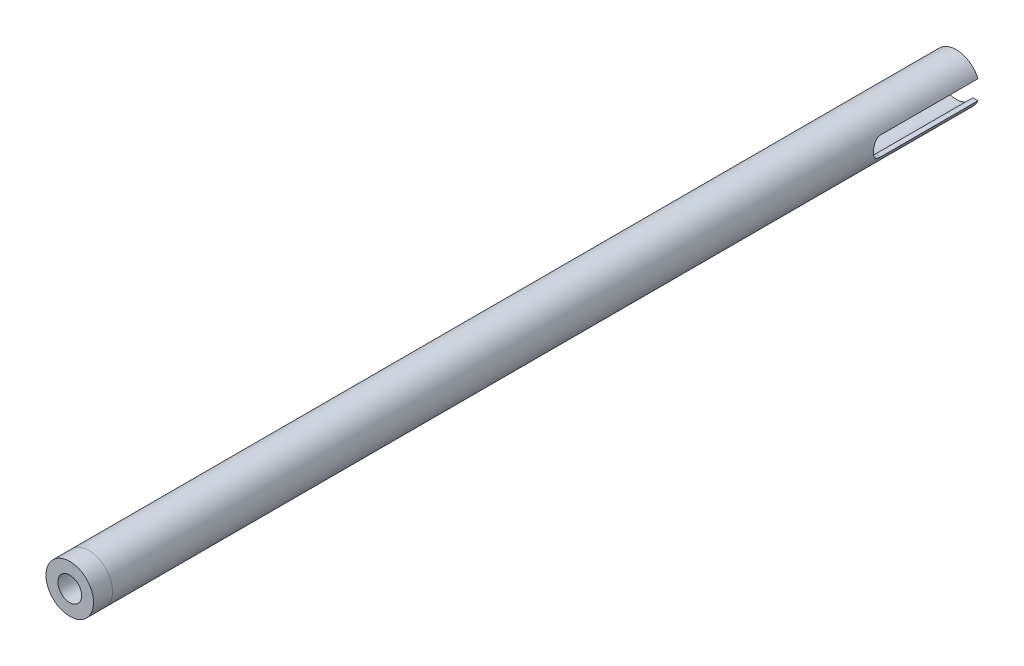
ISO-10303-21;
HEADER;
FILE_DESCRIPTION(('STEP AP214'),'2;1');
FILE_NAME('part.step','',(''),(''),'','','');
FILE_SCHEMA(('AUTOMOTIVE_DESIGN { 1 0 10303 214 1 1 1 1 }'));
ENDSEC;
DATA;
#1=APPLICATION_CONTEXT('core data for automotive mechanical design processes');
#2=APPLICATION_PROTOCOL_DEFINITION('international standard','automotive_design',2000,#1);
#3=PRODUCT_CONTEXT('',#1,'mechanical');
#4=PRODUCT('Part','Part','',(#3));
#5=PRODUCT_RELATED_PRODUCT_CATEGORY('part','',(#4));
#6=PRODUCT_DEFINITION_FORMATION('','',#4);
#7=PRODUCT_DEFINITION_CONTEXT('part definition',#1,'design');
#8=PRODUCT_DEFINITION('design','',#6,#7);
#9=PRODUCT_DEFINITION_SHAPE('','',#8);
#10=(LENGTH_UNIT() NAMED_UNIT(*) SI_UNIT(.MILLI.,.METRE.));
#11=(NAMED_UNIT(*) PLANE_ANGLE_UNIT() SI_UNIT($,.RADIAN.));
#12=(NAMED_UNIT(*) SI_UNIT($,.STERADIAN.) SOLID_ANGLE_UNIT());
#13=UNCERTAINTY_MEASURE_WITH_UNIT(LENGTH_MEASURE(1.E-05),#10,'distance_accuracy_value','');
#14=(GEOMETRIC_REPRESENTATION_CONTEXT(3) GLOBAL_UNCERTAINTY_ASSIGNED_CONTEXT((#13)) GLOBAL_UNIT_ASSIGNED_CONTEXT((#10,
#11,#12)) REPRESENTATION_CONTEXT('',''));
#15=CARTESIAN_POINT('',(0.,0.,0.));
#16=DIRECTION('',(0.,0.,1.));
#17=DIRECTION('',(1.,0.,0.));
#18=AXIS2_PLACEMENT_3D('',#15,#16,#17);
#19=CARTESIAN_POINT('',(0.,0.,-295.567143679194));
#20=DIRECTION('',(0.,0.,1.));
#21=DIRECTION('',(1.,0.,0.));
#22=AXIS2_PLACEMENT_3D('',#19,#20,#21);
#23=CYLINDRICAL_SURFACE('',#22,7.9375);
#24=CARTESIAN_POINT('',(0.,0.,-6.35));
#25=DIRECTION('',(0.,0.,1.));
#26=DIRECTION('',(1.,0.,0.));
#27=AXIS2_PLACEMENT_3D('',#24,#25,#26);
#28=CIRCLE('',#27,7.9375);
#29=CARTESIAN_POINT('',(7.9375,0.,-6.35));
#30=VERTEX_POINT('',#29);
#31=EDGE_CURVE('E165',#30,#30,#28,.T.);
#32=ORIENTED_EDGE('',*,*,#31,.F.);
#33=EDGE_LOOP('',(#32));
#34=FACE_BOUND('',#33,.T.);
#35=CARTESIAN_POINT('',(-7.2748389157424,3.175,-263.182143679194));
#36=CARTESIAN_POINT('',(-7.27482137043434,3.17501267173453,-263.096723563711));
#37=CARTESIAN_POINT('',(-7.27634297592672,3.17155313247793,-263.011313034149));
#38=CARTESIAN_POINT('',(-7.28233338484875,3.15778866907725,-262.841181029821));
#39=CARTESIAN_POINT('',(-7.28680106535325,3.14748635311323,-262.756459304962));
#40=CARTESIAN_POINT('',(-7.2985291631267,3.12019002880163,-262.588645605153));
#41=CARTESIAN_POINT('',(-7.30577831906487,3.10322299732752,-262.505548460394));
#42=CARTESIAN_POINT('',(-7.32282161153744,3.06278779397035,-262.341237358368));
#43=CARTESIAN_POINT('',(-7.33261590324725,3.03931922568674,-262.260023516255));
#44=CARTESIAN_POINT('',(-7.36535331460444,2.95952924342962,-262.020198693672));
#45=CARTESIAN_POINT('',(-7.39167595677839,2.89376893609239,-261.865073764868));
#46=CARTESIAN_POINT('',(-7.45033259991547,2.73920602658923,-261.567986338157));
#47=CARTESIAN_POINT('',(-7.48267254395243,2.65038060922872,-261.426037062939));
#48=CARTESIAN_POINT('',(-7.55175295441386,2.44684429809695,-261.15131629342));
#49=CARTESIAN_POINT('',(-7.58863404630154,2.33103943595689,-261.019388908908));
#50=CARTESIAN_POINT('',(-7.66147718953598,2.07914562663536,-260.776226025276));
#51=CARTESIAN_POINT('',(-7.69743902899202,1.94305205135848,-260.664995260348));
#52=CARTESIAN_POINT('',(-7.76611692840651,1.64778282664419,-260.462074060853));
#53=CARTESIAN_POINT('',(-7.79864638434712,1.48790317306356,-260.371339649449));
#54=CARTESIAN_POINT('',(-7.85502980346525,1.15369615984563,-260.218482096032));
#55=CARTESIAN_POINT('',(-7.87889360585224,0.979385463602722,-260.156326483414));
#56=CARTESIAN_POINT('',(-7.91022225039827,0.670405323433354,-260.075814839758));
#57=CARTESIAN_POINT('',(-7.92038443902171,0.537888188660439,-260.050136916349));
#58=CARTESIAN_POINT('',(-7.93061686811603,0.337231082382107,-260.024381833267));
#59=CARTESIAN_POINT('',(-7.93319257341971,0.269991647180298,-260.017923735987));
#60=CARTESIAN_POINT('',(-7.93663621925193,0.135173873369596,-260.009302718235));
#61=CARTESIAN_POINT('',(-7.93750363389236,0.0675954368175869,-260.007141120416));
#62=CARTESIAN_POINT('',(-7.9375,0.,-260.007143679194));
#63=B_SPLINE_CURVE_WITH_KNOTS('',3,(#35,#36,#37,#38,#39,#40,#41,#42,#43,#44,#45,#46,#47,#48,#49,
#50,#51,#52,#53,#54,#55,#56,#57,#58,#59,#60,#61,#62),.UNSPECIFIED.,.F.,.F.,(4,2,2,2,2,2,2,2,2,2,
2,2,2,4),(0.,0.256160797396612,0.512224013007058,0.767261264672238,1.02231406945471,
1.53142416248594,2.04103978047897,2.57679273649398,3.11266809162683,3.66991136029742,
4.22651992730645,4.63134321412666,4.8339937586662,5.03670667834028),.UNSPECIFIED.);
#64=CARTESIAN_POINT('',(-7.2748389157424,3.175,-263.182143679194));
#65=VERTEX_POINT('',#64);
#66=CARTESIAN_POINT('',(-7.9375,0.,-260.007143679194));
#67=VERTEX_POINT('',#66);
#68=EDGE_CURVE('E192',#65,#67,#63,.T.);
#69=ORIENTED_EDGE('',*,*,#68,.T.);
#70=CARTESIAN_POINT('',(-7.9375,0.,-260.007143679194));
#71=CARTESIAN_POINT('',(-7.93751279435796,-0.0856973243893185,-260.007131649025));
#72=CARTESIAN_POINT('',(-7.93611246860092,-0.171386675169291,-260.010613016497));
#73=CARTESIAN_POINT('',(-7.93058107051394,-0.342092796869088,-260.024469111831));
#74=CARTESIAN_POINT('',(-7.92645080745519,-0.427109759557717,-260.034841796815));
#75=CARTESIAN_POINT('',(-7.91557399086504,-0.595570690948319,-260.062338990882));
#76=CARTESIAN_POINT('',(-7.90883664469869,-0.67901912358001,-260.079439742155));
#77=CARTESIAN_POINT('',(-7.89293284658536,-0.844038966454646,-260.120206989628));
#78=CARTESIAN_POINT('',(-7.88376629739099,-0.925610301410303,-260.143873748685));
#79=CARTESIAN_POINT('',(-7.85297007832481,-1.16656173687588,-260.224381404384));
#80=CARTESIAN_POINT('',(-7.82802544143958,-1.32244720282989,-260.290774037261));
#81=CARTESIAN_POINT('',(-7.77174407779742,-1.62081902572888,-260.446819441254));
#82=CARTESIAN_POINT('',(-7.74040257287306,-1.7632952496653,-260.536489613317));
#83=CARTESIAN_POINT('',(-7.67287736621953,-2.03755465224644,-260.740943220832));
#84=CARTESIAN_POINT('',(-7.63654472176442,-2.16862853615059,-260.856630077564));
#85=CARTESIAN_POINT('',(-7.56380976030912,-2.41011022612819,-261.107924179273));
#86=CARTESIAN_POINT('',(-7.52740741976911,-2.52050895891189,-261.243540123755));
#87=CARTESIAN_POINT('',(-7.45683282624284,-2.72240939900242,-261.538238618621));
#88=CARTESIAN_POINT('',(-7.4228346735038,-2.81283701743189,-261.698102608537));
#89=CARTESIAN_POINT('',(-7.3633362219632,-2.96511894168388,-262.032228573333));
#90=CARTESIAN_POINT('',(-7.33782422493328,-3.02701262758154,-262.206470311092));
#91=CARTESIAN_POINT('',(-7.30424985403508,-3.10695047193342,-262.514774035744));
#92=CARTESIAN_POINT('',(-7.29331360019113,-3.13238569878909,-262.64663279663));
#93=CARTESIAN_POINT('',(-7.28227977674291,-3.15790858319001,-262.846349678324));
#94=CARTESIAN_POINT('',(-7.27949685702346,-3.16431127275807,-262.913297969083));
#95=CARTESIAN_POINT('',(-7.27577355567174,-3.17285909036155,-263.04753952695));
#96=CARTESIAN_POINT('',(-7.27483380475762,-3.1750027609968,-263.114832904247));
#97=CARTESIAN_POINT('',(-7.2748389157424,-3.175,-263.182143679194));
#98=B_SPLINE_CURVE_WITH_KNOTS('',3,(#70,#71,#72,#73,#74,#75,#76,#77,#78,#79,#80,#81,#82,#83,#84,
#85,#86,#87,#88,#89,#90,#91,#92,#93,#94,#95,#96,#97),.UNSPECIFIED.,.F.,.F.,(4,2,2,2,2,2,2,2,2,2,
2,2,2,4),(0.,0.256996432008007,0.513916713336978,0.769937797705386,1.02596913282157,
1.53722547809954,2.04886511530059,2.58219314099272,3.11575467201799,3.67332953074261,
4.2301325519037,4.63306130520181,4.83485003827446,5.03670780985612),.UNSPECIFIED.);
#99=CARTESIAN_POINT('',(-7.2748389157424,-3.175,-263.182143679194));
#100=VERTEX_POINT('',#99);
#101=EDGE_CURVE('E144',#67,#100,#98,.T.);
#102=ORIENTED_EDGE('',*,*,#101,.T.);
#103=DIRECTION('',(0.,0.,-1.));
#104=VECTOR('',#103,1.);
#105=CARTESIAN_POINT('',(-7.2748389157424,-3.175,-260.007143679194));
#106=LINE('',#105,#104);
#107=CARTESIAN_POINT('',(-7.2748389157424,-3.175,-295.567143679194));
#108=VERTEX_POINT('',#107);
#109=EDGE_CURVE('E139',#100,#108,#106,.T.);
#110=ORIENTED_EDGE('',*,*,#109,.T.);
#111=CARTESIAN_POINT('',(0.,0.,-295.567143679194));
#112=DIRECTION('',(0.,0.,1.));
#113=DIRECTION('',(1.,0.,0.));
#114=AXIS2_PLACEMENT_3D('',#111,#112,#113);
#115=CIRCLE('',#114,7.9375);
#116=CARTESIAN_POINT('',(7.2748389157424,-3.175,-295.567143679194));
#117=VERTEX_POINT('',#116);
#118=EDGE_CURVE('E142',#108,#117,#115,.T.);
#119=ORIENTED_EDGE('',*,*,#118,.T.);
#120=DIRECTION('',(0.,0.,-1.));
#121=VECTOR('',#120,1.);
#122=CARTESIAN_POINT('',(7.2748389157424,-3.175,-260.007143679194));
#123=LINE('',#122,#121);
#124=CARTESIAN_POINT('',(7.2748389157424,-3.175,-263.182143679194));
#125=VERTEX_POINT('',#124);
#126=EDGE_CURVE('E425',#125,#117,#123,.T.);
#127=ORIENTED_EDGE('',*,*,#126,.F.);
#128=CARTESIAN_POINT('',(7.2748389157424,-3.175,-263.182143679194));
#129=CARTESIAN_POINT('',(7.27482137043434,-3.17501267173453,-263.096723563711));
#130=CARTESIAN_POINT('',(7.27634297592672,-3.17155313247793,-263.011313034149));
#131=CARTESIAN_POINT('',(7.28233338484875,-3.15778866907725,-262.841181029821));
#132=CARTESIAN_POINT('',(7.28680106535325,-3.14748635311323,-262.756459304962));
#133=CARTESIAN_POINT('',(7.2985291631267,-3.12019002880163,-262.588645605153));
#134=CARTESIAN_POINT('',(7.30577831906487,-3.10322299732752,-262.505548460394));
#135=CARTESIAN_POINT('',(7.32282161153744,-3.06278779397035,-262.341237358368));
#136=CARTESIAN_POINT('',(7.33261590324725,-3.03931922568674,-262.260023516255));
#137=CARTESIAN_POINT('',(7.36535331460444,-2.95952924342962,-262.020198693672));
#138=CARTESIAN_POINT('',(7.39167595677839,-2.89376893609239,-261.865073764868));
#139=CARTESIAN_POINT('',(7.45033259991547,-2.73920602658923,-261.567986338157));
#140=CARTESIAN_POINT('',(7.48267254395243,-2.65038060922872,-261.426037062939));
#141=CARTESIAN_POINT('',(7.55175295441386,-2.44684429809695,-261.15131629342));
#142=CARTESIAN_POINT('',(7.58863404630154,-2.33103943595689,-261.019388908908));
#143=CARTESIAN_POINT('',(7.66147718953598,-2.07914562663536,-260.776226025276));
#144=CARTESIAN_POINT('',(7.69743902899202,-1.94305205135848,-260.664995260348));
#145=CARTESIAN_POINT('',(7.76611692840651,-1.64778282664419,-260.462074060853));
#146=CARTESIAN_POINT('',(7.79864638434712,-1.48790317306356,-260.371339649449));
#147=CARTESIAN_POINT('',(7.85502980346525,-1.15369615984563,-260.218482096032));
#148=CARTESIAN_POINT('',(7.87889360585224,-0.979385463602722,-260.156326483414));
#149=CARTESIAN_POINT('',(7.91022225039827,-0.670405323433354,-260.075814839758));
#150=CARTESIAN_POINT('',(7.92038443902171,-0.537888188660439,-260.050136916349));
#151=CARTESIAN_POINT('',(7.93061686811603,-0.337231082382107,-260.024381833267));
#152=CARTESIAN_POINT('',(7.93319257341971,-0.269991647180298,-260.017923735987));
#153=CARTESIAN_POINT('',(7.93663621925193,-0.135173873369596,-260.009302718235));
#154=CARTESIAN_POINT('',(7.93750363389236,-0.0675954368175869,-260.007141120416));
#155=CARTESIAN_POINT('',(7.9375,0.,-260.007143679194));
#156=B_SPLINE_CURVE_WITH_KNOTS('',3,(#128,#129,#130,#131,#132,#133,#134,#135,#136,#137,#138,
#139,#140,#141,#142,#143,#144,#145,#146,#147,#148,#149,#150,#151,#152,#153,#154,#155),
.UNSPECIFIED.,.F.,.F.,(4,2,2,2,2,2,2,2,2,2,2,2,2,4),(0.,0.256160797396612,0.512224013007058,
0.767261264672238,1.02231406945471,1.53142416248594,2.04103978047897,2.57679273649398,
3.11266809162683,3.66991136029742,4.22651992730645,4.63134321412666,4.8339937586662,
5.03670667834028),.UNSPECIFIED.);
#157=CARTESIAN_POINT('',(7.9375,0.,-260.007143679194));
#158=VERTEX_POINT('',#157);
#159=EDGE_CURVE('E85',#125,#158,#156,.T.);
#160=ORIENTED_EDGE('',*,*,#159,.T.);
#161=CARTESIAN_POINT('',(7.9375,0.,-260.007143679194));
#162=CARTESIAN_POINT('',(7.93751279435796,0.0856973243893185,-260.007131649025));
#163=CARTESIAN_POINT('',(7.93611246860092,0.171386675169291,-260.010613016497));
#164=CARTESIAN_POINT('',(7.93058107051394,0.342092796869088,-260.024469111831));
#165=CARTESIAN_POINT('',(7.92645080745519,0.427109759557717,-260.034841796815));
#166=CARTESIAN_POINT('',(7.91557399086504,0.595570690948319,-260.062338990882));
#167=CARTESIAN_POINT('',(7.90883664469869,0.67901912358001,-260.079439742155));
#168=CARTESIAN_POINT('',(7.89293284658536,0.844038966454646,-260.120206989628));
#169=CARTESIAN_POINT('',(7.88376629739099,0.925610301410303,-260.143873748685));
#170=CARTESIAN_POINT('',(7.85297007832481,1.16656173687588,-260.224381404384));
#171=CARTESIAN_POINT('',(7.82802544143958,1.32244720282989,-260.290774037261));
#172=CARTESIAN_POINT('',(7.77174407779742,1.62081902572888,-260.446819441254));
#173=CARTESIAN_POINT('',(7.74040257287306,1.7632952496653,-260.536489613317));
#174=CARTESIAN_POINT('',(7.67287736621953,2.03755465224644,-260.740943220832));
#175=CARTESIAN_POINT('',(7.63654472176442,2.16862853615059,-260.856630077564));
#176=CARTESIAN_POINT('',(7.56380976030912,2.41011022612819,-261.107924179273));
#177=CARTESIAN_POINT('',(7.52740741976911,2.52050895891189,-261.243540123755));
#178=CARTESIAN_POINT('',(7.45683282624284,2.72240939900242,-261.538238618621));
#179=CARTESIAN_POINT('',(7.4228346735038,2.81283701743189,-261.698102608537));
#180=CARTESIAN_POINT('',(7.3633362219632,2.96511894168388,-262.032228573333));
#181=CARTESIAN_POINT('',(7.33782422493328,3.02701262758154,-262.206470311092));
#182=CARTESIAN_POINT('',(7.30424985403508,3.10695047193342,-262.514774035744));
#183=CARTESIAN_POINT('',(7.29331360019113,3.13238569878909,-262.64663279663));
#184=CARTESIAN_POINT('',(7.28227977674291,3.15790858319001,-262.846349678324));
#185=CARTESIAN_POINT('',(7.27949685702346,3.16431127275807,-262.913297969083));
#186=CARTESIAN_POINT('',(7.27577355567174,3.17285909036155,-263.04753952695));
#187=CARTESIAN_POINT('',(7.27483380475762,3.1750027609968,-263.114832904247));
#188=CARTESIAN_POINT('',(7.2748389157424,3.175,-263.182143679194));
#189=B_SPLINE_CURVE_WITH_KNOTS('',3,(#161,#162,#163,#164,#165,#166,#167,#168,#169,#170,#171,
#172,#173,#174,#175,#176,#177,#178,#179,#180,#181,#182,#183,#184,#185,#186,#187,#188),
.UNSPECIFIED.,.F.,.F.,(4,2,2,2,2,2,2,2,2,2,2,2,2,4),(0.,0.256996432008007,0.513916713336978,
0.769937797705386,1.02596913282157,1.53722547809954,2.04886511530059,2.58219314099272,
3.11575467201799,3.67332953074261,4.2301325519037,4.63306130520181,4.83485003827446,
5.03670780985612),.UNSPECIFIED.);
#190=CARTESIAN_POINT('',(7.2748389157424,3.175,-263.182143679194));
#191=VERTEX_POINT('',#190);
#192=EDGE_CURVE('E71',#158,#191,#189,.T.);
#193=ORIENTED_EDGE('',*,*,#192,.T.);
#194=DIRECTION('',(0.,0.,-1.));
#195=VECTOR('',#194,1.);
#196=CARTESIAN_POINT('',(7.2748389157424,3.175,-260.007143679194));
#197=LINE('',#196,#195);
#198=CARTESIAN_POINT('',(7.2748389157424,3.175,-295.567143679194));
#199=VERTEX_POINT('',#198);
#200=EDGE_CURVE('E158',#191,#199,#197,.T.);
#201=ORIENTED_EDGE('',*,*,#200,.T.);
#202=CARTESIAN_POINT('',(-7.2748389157424,3.175,-295.567143679194));
#203=VERTEX_POINT('',#202);
#204=EDGE_CURVE('E164',#199,#203,#115,.T.);
#205=ORIENTED_EDGE('',*,*,#204,.T.);
#206=DIRECTION('',(0.,0.,-1.));
#207=VECTOR('',#206,1.);
#208=CARTESIAN_POINT('',(-7.2748389157424,3.175,-260.007143679194));
#209=LINE('',#208,#207);
#210=EDGE_CURVE('E418',#65,#203,#209,.T.);
#211=ORIENTED_EDGE('',*,*,#210,.F.);
#212=EDGE_LOOP('',(#69,#102,#110,#119,#127,#160,#193,#201,#205,#211));
#213=FACE_BOUND('',#212,.T.);
#214=ADVANCED_FACE('F61',(#34,#213),#23,.T.);
#215=CARTESIAN_POINT('',(0.,0.,-295.567143679194));
#216=DIRECTION('',(0.,0.,1.));
#217=DIRECTION('',(1.,0.,0.));
#218=AXIS2_PLACEMENT_3D('',#215,#216,#217);
#219=PLANE('',#218);
#220=DIRECTION('',(1.,0.,0.));
#221=VECTOR('',#220,1.);
#222=CARTESIAN_POINT('',(0.,-3.175,-295.567143679194));
#223=LINE('',#222,#221);
#224=CARTESIAN_POINT('',(-5.57246419907746,-3.175,-295.567143679194));
#225=VERTEX_POINT('',#224);
#226=EDGE_CURVE('E151',#108,#225,#223,.T.);
#227=ORIENTED_EDGE('',*,*,#226,.T.);
#228=CARTESIAN_POINT('',(0.,0.,-295.567143679194));
#229=DIRECTION('',(0.,0.,1.));
#230=DIRECTION('',(1.,0.,0.));
#231=AXIS2_PLACEMENT_3D('',#228,#229,#230);
#232=CIRCLE('',#231,6.4135);
#233=CARTESIAN_POINT('',(5.57246419907746,-3.175,-295.567143679194));
#234=VERTEX_POINT('',#233);
#235=EDGE_CURVE('E273',#225,#234,#232,.T.);
#236=ORIENTED_EDGE('',*,*,#235,.T.);
#237=DIRECTION('',(1.,0.,0.));
#238=VECTOR('',#237,1.);
#239=CARTESIAN_POINT('',(0.,-3.175,-295.567143679194));
#240=LINE('',#239,#238);
#241=EDGE_CURVE('E163',#234,#117,#240,.T.);
#242=ORIENTED_EDGE('',*,*,#241,.T.);
#243=ORIENTED_EDGE('',*,*,#118,.F.);
#244=EDGE_LOOP('',(#227,#236,#242,#243));
#245=FACE_BOUND('',#244,.T.);
#246=ADVANCED_FACE('F161',(#245),#219,.F.);
#247=CARTESIAN_POINT('',(0.,0.,-295.567143679194));
#248=DIRECTION('',(0.,0.,1.));
#249=DIRECTION('',(1.,0.,0.));
#250=AXIS2_PLACEMENT_3D('',#247,#248,#249);
#251=CYLINDRICAL_SURFACE('',#250,6.4135);
#252=CARTESIAN_POINT('',(0.,0.,-6.35));
#253=DIRECTION('',(0.,0.,1.));
#254=DIRECTION('',(1.,0.,0.));
#255=AXIS2_PLACEMENT_3D('',#252,#253,#254);
#256=CIRCLE('',#255,6.4135);
#257=CARTESIAN_POINT('',(6.4135,0.,-6.35));
#258=VERTEX_POINT('',#257);
#259=EDGE_CURVE('E147',#258,#258,#256,.T.);
#260=ORIENTED_EDGE('',*,*,#259,.T.);
#261=EDGE_LOOP('',(#260));
#262=FACE_BOUND('',#261,.T.);
#263=DIRECTION('',(0.,0.,-1.));
#264=VECTOR('',#263,1.);
#265=CARTESIAN_POINT('',(-5.57246419907746,-3.175,-260.007143679194));
#266=LINE('',#265,#264);
#267=CARTESIAN_POINT('',(-5.57246419907746,-3.175,-263.182143679194));
#268=VERTEX_POINT('',#267);
#269=EDGE_CURVE('E148',#268,#225,#266,.T.);
#270=ORIENTED_EDGE('',*,*,#269,.F.);
#271=CARTESIAN_POINT('',(-5.57246419907746,-3.175,-263.182143679194));
#272=CARTESIAN_POINT('',(-5.57244013006406,-3.17501485930532,-263.098864566155));
#273=CARTESIAN_POINT('',(-5.57433046393327,-3.17172393593588,-263.015598799285));
#274=CARTESIAN_POINT('',(-5.58175879139227,-3.15864741746939,-262.849791214473));
#275=CARTESIAN_POINT('',(-5.58729459414879,-3.14886572313217,-262.767248991872));
#276=CARTESIAN_POINT('',(-5.60179156831922,-3.12299843383605,-262.603952185143));
#277=CARTESIAN_POINT('',(-5.61073298145,-3.10694918790095,-262.523190080229));
#278=CARTESIAN_POINT('',(-5.63171276239417,-3.06875665913499,-262.363546164728));
#279=CARTESIAN_POINT('',(-5.64375147558632,-3.04661269666535,-262.284664564908));
#280=CARTESIAN_POINT('',(-5.6838799338154,-2.97148657354666,-262.05193138991));
#281=CARTESIAN_POINT('',(-5.71602843451584,-2.90973243042152,-261.901510892671));
#282=CARTESIAN_POINT('',(-5.78746445334561,-2.76491119647661,-261.613053675843));
#283=CARTESIAN_POINT('',(-5.8267630725243,-2.68181088046089,-261.475036718477));
#284=CARTESIAN_POINT('',(-5.91189137020974,-2.48887418737119,-261.203239634448));
#285=CARTESIAN_POINT('',(-5.95799203211627,-2.37743022169016,-261.070682831997));
#286=CARTESIAN_POINT('',(-6.04933625068999,-2.13433179626949,-260.825215162924));
#287=CARTESIAN_POINT('',(-6.09457954365871,-2.00267122837297,-260.712310255911));
#288=CARTESIAN_POINT('',(-6.18270630442022,-1.71220053093684,-260.501990963459));
#289=CARTESIAN_POINT('',(-6.22523407848511,-1.55216870534977,-260.406101213028));
#290=CARTESIAN_POINT('',(-6.29953728626817,-1.21586879246633,-260.243252316711));
#291=CARTESIAN_POINT('',(-6.33132906884324,-1.03962591706377,-260.176249138668));
#292=CARTESIAN_POINT('',(-6.37455801221378,-0.719418942476251,-260.086377306337));
#293=CARTESIAN_POINT('',(-6.38903678436651,-0.577736145507957,-260.056804591973));
#294=CARTESIAN_POINT('',(-6.40364692368403,-0.362616983152034,-260.027083517658));
#295=CARTESIAN_POINT('',(-6.40733246196224,-0.290370591494075,-260.019616005021));
#296=CARTESIAN_POINT('',(-6.41226237468065,-0.145424356491903,-260.009643116083));
#297=CARTESIAN_POINT('',(-6.41350576158006,-0.0727243416303698,-260.007139747146));
#298=CARTESIAN_POINT('',(-6.4135,0.,-260.007143679194));
#299=B_SPLINE_CURVE_WITH_KNOTS('',3,(#271,#272,#273,#274,#275,#276,#277,#278,#279,#280,#281,
#282,#283,#284,#285,#286,#287,#288,#289,#290,#291,#292,#293,#294,#295,#296,#297,#298),
.UNSPECIFIED.,.F.,.F.,(4,2,2,2,2,2,2,2,2,2,2,2,2,4),(0.,0.249729002226608,0.499308060527582,
0.747460667546715,0.995640957972498,1.49055300136654,1.98624009021394,2.52160227908797,
3.05712653941521,3.62817923327589,4.19835836008502,4.63305000595099,4.85103401853339,
5.06910615989469),.UNSPECIFIED.);
#300=CARTESIAN_POINT('',(-6.4135,0.,-260.007143679194));
#301=VERTEX_POINT('',#300);
#302=EDGE_CURVE('E219',#268,#301,#299,.T.);
#303=ORIENTED_EDGE('',*,*,#302,.T.);
#304=CARTESIAN_POINT('',(-6.4135,0.,-260.007143679194));
#305=CARTESIAN_POINT('',(-6.41351478956105,0.0839162873638195,-260.007130279298));
#306=CARTESIAN_POINT('',(-6.41185341043851,0.167823114288182,-260.010470205345));
#307=CARTESIAN_POINT('',(-6.40528923860734,0.33495253632637,-260.02375264595));
#308=CARTESIAN_POINT('',(-6.40038773102953,0.418175389480093,-260.033692542771));
#309=CARTESIAN_POINT('',(-6.38748331817869,0.58296549878522,-260.060011347289));
#310=CARTESIAN_POINT('',(-6.37949454331383,0.664538541389253,-260.076360922777));
#311=CARTESIAN_POINT('',(-6.36062930478242,0.825821595252368,-260.11529922637));
#312=CARTESIAN_POINT('',(-6.34975266552956,0.905531492908811,-260.137888333851));
#313=CARTESIAN_POINT('',(-6.31319792977548,1.14087800407252,-260.214624896611));
#314=CARTESIAN_POINT('',(-6.28356695572383,1.29306927815055,-260.277796544799));
#315=CARTESIAN_POINT('',(-6.21648032622801,1.58455945770353,-260.425947286779));
#316=CARTESIAN_POINT('',(-6.17901685649499,1.72384528592309,-260.510948178558));
#317=CARTESIAN_POINT('',(-6.09713913910647,1.99475482128856,-260.706048316809));
#318=CARTESIAN_POINT('',(-6.05244508581476,2.12544046453043,-260.817333193548));
#319=CARTESIAN_POINT('',(-5.96206469267669,2.36716277188881,-261.059302639713));
#320=CARTESIAN_POINT('',(-5.9163776032387,2.47818397002904,-261.190002331553));
#321=CARTESIAN_POINT('',(-5.82517699615972,2.68591268931947,-261.479048160505));
#322=CARTESIAN_POINT('',(-5.77994318763785,2.78087960507694,-261.638743355085));
#323=CARTESIAN_POINT('',(-5.69959190124919,2.9420744279085,-261.974126632267));
#324=CARTESIAN_POINT('',(-5.66445328320705,3.00836254036259,-262.149780265438));
#325=CARTESIAN_POINT('',(-5.61637168534323,3.09697219420915,-262.468231639832));
#326=CARTESIAN_POINT('',(-5.60011055849822,3.1260622343607,-262.608646242492));
#327=CARTESIAN_POINT('',(-5.58363385282995,3.15533369889112,-262.822023120734));
#328=CARTESIAN_POINT('',(-5.57946041232981,3.16269716900745,-262.893754845616));
#329=CARTESIAN_POINT('',(-5.57386984218861,3.17253394278506,-263.037696785659));
#330=CARTESIAN_POINT('',(-5.57245416126573,3.17500467618403,-263.10990723233));
#331=CARTESIAN_POINT('',(-5.57246419907746,3.175,-263.182143679194));
#332=B_SPLINE_CURVE_WITH_KNOTS('',3,(#304,#305,#306,#307,#308,#309,#310,#311,#312,#313,#314,
#315,#316,#317,#318,#319,#320,#321,#322,#323,#324,#325,#326,#327,#328,#329,#330,#331),
.UNSPECIFIED.,.F.,.F.,(4,2,2,2,2,2,2,2,2,2,2,2,2,4),(0.,0.251650249697328,0.503200747298848,
0.75361328099314,1.00404104361821,1.50387930503274,2.00421864304453,2.53410176460237,
3.06439980342596,3.63519589642624,4.20478783377489,4.63602373673194,4.85251353275904,
5.06911702550462),.UNSPECIFIED.);
#333=CARTESIAN_POINT('',(-5.57246419907746,3.175,-263.182143679194));
#334=VERTEX_POINT('',#333);
#335=EDGE_CURVE('E184',#301,#334,#332,.T.);
#336=ORIENTED_EDGE('',*,*,#335,.T.);
#337=DIRECTION('',(0.,0.,-1.));
#338=VECTOR('',#337,1.);
#339=CARTESIAN_POINT('',(-5.57246419907746,3.175,-260.007143679194));
#340=LINE('',#339,#338);
#341=CARTESIAN_POINT('',(-5.57246419907746,3.175,-295.567143679194));
#342=VERTEX_POINT('',#341);
#343=EDGE_CURVE('E415',#334,#342,#340,.T.);
#344=ORIENTED_EDGE('',*,*,#343,.T.);
#345=CARTESIAN_POINT('',(5.57246419907746,3.175,-295.567143679194));
#346=VERTEX_POINT('',#345);
#347=EDGE_CURVE('E170',#346,#342,#232,.T.);
#348=ORIENTED_EDGE('',*,*,#347,.F.);
#349=DIRECTION('',(0.,0.,-1.));
#350=VECTOR('',#349,1.);
#351=CARTESIAN_POINT('',(5.57246419907746,3.175,-260.007143679194));
#352=LINE('',#351,#350);
#353=CARTESIAN_POINT('',(5.57246419907746,3.175,-263.182143679194));
#354=VERTEX_POINT('',#353);
#355=EDGE_CURVE('E267',#354,#346,#352,.T.);
#356=ORIENTED_EDGE('',*,*,#355,.F.);
#357=CARTESIAN_POINT('',(5.57246419907746,3.175,-263.182143679194));
#358=CARTESIAN_POINT('',(5.57244013006406,3.17501485930532,-263.098864566155));
#359=CARTESIAN_POINT('',(5.57433046393327,3.17172393593588,-263.015598799285));
#360=CARTESIAN_POINT('',(5.58175879139227,3.15864741746939,-262.849791214473));
#361=CARTESIAN_POINT('',(5.58729459414879,3.14886572313217,-262.767248991872));
#362=CARTESIAN_POINT('',(5.60179156831922,3.12299843383605,-262.603952185143));
#363=CARTESIAN_POINT('',(5.61073298145,3.10694918790095,-262.523190080229));
#364=CARTESIAN_POINT('',(5.63171276239417,3.06875665913499,-262.363546164728));
#365=CARTESIAN_POINT('',(5.64375147558632,3.04661269666535,-262.284664564908));
#366=CARTESIAN_POINT('',(5.6838799338154,2.97148657354666,-262.05193138991));
#367=CARTESIAN_POINT('',(5.71602843451584,2.90973243042152,-261.901510892671));
#368=CARTESIAN_POINT('',(5.78746445334561,2.76491119647661,-261.613053675843));
#369=CARTESIAN_POINT('',(5.8267630725243,2.68181088046089,-261.475036718477));
#370=CARTESIAN_POINT('',(5.91189137020974,2.48887418737119,-261.203239634448));
#371=CARTESIAN_POINT('',(5.95799203211627,2.37743022169016,-261.070682831997));
#372=CARTESIAN_POINT('',(6.04933625068999,2.13433179626949,-260.825215162924));
#373=CARTESIAN_POINT('',(6.09457954365871,2.00267122837297,-260.712310255911));
#374=CARTESIAN_POINT('',(6.18270630442022,1.71220053093684,-260.501990963459));
#375=CARTESIAN_POINT('',(6.22523407848511,1.55216870534977,-260.406101213028));
#376=CARTESIAN_POINT('',(6.29953728626817,1.21586879246633,-260.243252316711));
#377=CARTESIAN_POINT('',(6.33132906884324,1.03962591706377,-260.176249138668));
#378=CARTESIAN_POINT('',(6.37455801221378,0.719418942476251,-260.086377306337));
#379=CARTESIAN_POINT('',(6.38903678436651,0.577736145507957,-260.056804591973));
#380=CARTESIAN_POINT('',(6.40364692368403,0.362616983152034,-260.027083517658));
#381=CARTESIAN_POINT('',(6.40733246196224,0.290370591494075,-260.019616005021));
#382=CARTESIAN_POINT('',(6.41226237468065,0.145424356491903,-260.009643116083));
#383=CARTESIAN_POINT('',(6.41350576158006,0.0727243416303698,-260.007139747146));
#384=CARTESIAN_POINT('',(6.4135,0.,-260.007143679194));
#385=B_SPLINE_CURVE_WITH_KNOTS('',3,(#357,#358,#359,#360,#361,#362,#363,#364,#365,#366,#367,
#368,#369,#370,#371,#372,#373,#374,#375,#376,#377,#378,#379,#380,#381,#382,#383,#384),
.UNSPECIFIED.,.F.,.F.,(4,2,2,2,2,2,2,2,2,2,2,2,2,4),(0.,0.249729002226608,0.499308060527582,
0.747460667546715,0.995640957972498,1.49055300136654,1.98624009021394,2.52160227908797,
3.05712653941521,3.62817923327589,4.19835836008502,4.63305000595099,4.85103401853339,
5.06910615989469),.UNSPECIFIED.);
#386=CARTESIAN_POINT('',(6.4135,0.,-260.007143679194));
#387=VERTEX_POINT('',#386);
#388=EDGE_CURVE('E13',#354,#387,#385,.T.);
#389=ORIENTED_EDGE('',*,*,#388,.T.);
#390=CARTESIAN_POINT('',(6.4135,0.,-260.007143679194));
#391=CARTESIAN_POINT('',(6.41351478956105,-0.0839162873638195,-260.007130279298));
#392=CARTESIAN_POINT('',(6.41185341043851,-0.167823114288182,-260.010470205345));
#393=CARTESIAN_POINT('',(6.40528923860734,-0.33495253632637,-260.02375264595));
#394=CARTESIAN_POINT('',(6.40038773102953,-0.418175389480093,-260.033692542771));
#395=CARTESIAN_POINT('',(6.38748331817869,-0.58296549878522,-260.060011347289));
#396=CARTESIAN_POINT('',(6.37949454331383,-0.664538541389253,-260.076360922777));
#397=CARTESIAN_POINT('',(6.36062930478242,-0.825821595252368,-260.11529922637));
#398=CARTESIAN_POINT('',(6.34975266552956,-0.905531492908811,-260.137888333851));
#399=CARTESIAN_POINT('',(6.31319792977548,-1.14087800407252,-260.214624896611));
#400=CARTESIAN_POINT('',(6.28356695572383,-1.29306927815055,-260.277796544799));
#401=CARTESIAN_POINT('',(6.21648032622801,-1.58455945770353,-260.425947286779));
#402=CARTESIAN_POINT('',(6.17901685649499,-1.72384528592309,-260.510948178558));
#403=CARTESIAN_POINT('',(6.09713913910647,-1.99475482128856,-260.706048316809));
#404=CARTESIAN_POINT('',(6.05244508581476,-2.12544046453043,-260.817333193548));
#405=CARTESIAN_POINT('',(5.96206469267669,-2.36716277188881,-261.059302639713));
#406=CARTESIAN_POINT('',(5.9163776032387,-2.47818397002904,-261.190002331553));
#407=CARTESIAN_POINT('',(5.82517699615972,-2.68591268931947,-261.479048160505));
#408=CARTESIAN_POINT('',(5.77994318763785,-2.78087960507694,-261.638743355085));
#409=CARTESIAN_POINT('',(5.69959190124919,-2.9420744279085,-261.974126632267));
#410=CARTESIAN_POINT('',(5.66445328320705,-3.00836254036259,-262.149780265438));
#411=CARTESIAN_POINT('',(5.61637168534323,-3.09697219420915,-262.468231639832));
#412=CARTESIAN_POINT('',(5.60011055849822,-3.1260622343607,-262.608646242492));
#413=CARTESIAN_POINT('',(5.58363385282995,-3.15533369889112,-262.822023120734));
#414=CARTESIAN_POINT('',(5.57946041232981,-3.16269716900745,-262.893754845616));
#415=CARTESIAN_POINT('',(5.57386984218861,-3.17253394278506,-263.037696785659));
#416=CARTESIAN_POINT('',(5.57245416126573,-3.17500467618403,-263.10990723233));
#417=CARTESIAN_POINT('',(5.57246419907746,-3.175,-263.182143679194));
#418=B_SPLINE_CURVE_WITH_KNOTS('',3,(#390,#391,#392,#393,#394,#395,#396,#397,#398,#399,#400,
#401,#402,#403,#404,#405,#406,#407,#408,#409,#410,#411,#412,#413,#414,#415,#416,#417),
.UNSPECIFIED.,.F.,.F.,(4,2,2,2,2,2,2,2,2,2,2,2,2,4),(0.,0.251650249697328,0.503200747298848,
0.75361328099314,1.00404104361821,1.50387930503274,2.00421864304453,2.53410176460237,
3.06439980342596,3.63519589642624,4.20478783377489,4.63602373673194,4.85251353275904,
5.06911702550462),.UNSPECIFIED.);
#419=CARTESIAN_POINT('',(5.57246419907746,-3.175,-263.182143679194));
#420=VERTEX_POINT('',#419);
#421=EDGE_CURVE('E235',#387,#420,#418,.T.);
#422=ORIENTED_EDGE('',*,*,#421,.T.);
#423=DIRECTION('',(0.,0.,-1.));
#424=VECTOR('',#423,1.);
#425=CARTESIAN_POINT('',(5.57246419907746,-3.175,-260.007143679194));
#426=LINE('',#425,#424);
#427=EDGE_CURVE('E269',#420,#234,#426,.T.);
#428=ORIENTED_EDGE('',*,*,#427,.T.);
#429=ORIENTED_EDGE('',*,*,#235,.F.);
#430=EDGE_LOOP('',(#270,#303,#336,#344,#348,#356,#389,#422,#428,#429));
#431=FACE_BOUND('',#430,.T.);
#432=ADVANCED_FACE('F199',(#262,#431),#251,.F.);
#433=ORIENTED_EDGE('',*,*,#347,.T.);
#434=DIRECTION('',(1.,0.,0.));
#435=VECTOR('',#434,1.);
#436=CARTESIAN_POINT('',(0.,3.175,-295.567143679194));
#437=LINE('',#436,#435);
#438=EDGE_CURVE('E157',#203,#342,#437,.T.);
#439=ORIENTED_EDGE('',*,*,#438,.F.);
#440=ORIENTED_EDGE('',*,*,#204,.F.);
#441=DIRECTION('',(1.,0.,0.));
#442=VECTOR('',#441,1.);
#443=CARTESIAN_POINT('',(0.,3.175,-295.567143679194));
#444=LINE('',#443,#442);
#445=EDGE_CURVE('E251',#346,#199,#444,.T.);
#446=ORIENTED_EDGE('',*,*,#445,.F.);
#447=EDGE_LOOP('',(#433,#439,#440,#446));
#448=FACE_BOUND('',#447,.T.);
#449=ADVANCED_FACE('F284',(#448),#219,.F.);
#450=CARTESIAN_POINT('',(0.,0.,-6.35));
#451=DIRECTION('',(0.,0.,1.));
#452=DIRECTION('',(1.,0.,0.));
#453=AXIS2_PLACEMENT_3D('',#450,#451,#452);
#454=PLANE('',#453);
#455=ORIENTED_EDGE('',*,*,#259,.F.);
#456=EDGE_LOOP('',(#455));
#457=FACE_BOUND('',#456,.T.);
#458=ORIENTED_EDGE('',*,*,#31,.T.);
#459=EDGE_LOOP('',(#458));
#460=FACE_BOUND('',#459,.T.);
#461=ADVANCED_FACE('F281',(#457,#460),#454,.T.);
#462=CARTESIAN_POINT('',(0.,3.175,-260.007143679194));
#463=DIRECTION('',(0.,1.,0.));
#464=DIRECTION('',(0.,0.,1.));
#465=AXIS2_PLACEMENT_3D('',#462,#463,#464);
#466=PLANE('',#465);
#467=ORIENTED_EDGE('',*,*,#200,.F.);
#468=DIRECTION('',(1.,0.,0.));
#469=VECTOR('',#468,1.);
#470=CARTESIAN_POINT('',(5.57246419907746,3.175,-263.182143679194));
#471=LINE('',#470,#469);
#472=EDGE_CURVE('E182',#191,#354,#471,.F.);
#473=ORIENTED_EDGE('',*,*,#472,.T.);
#474=ORIENTED_EDGE('',*,*,#355,.T.);
#475=ORIENTED_EDGE('',*,*,#445,.T.);
#476=EDGE_LOOP('',(#467,#473,#474,#475));
#477=FACE_BOUND('',#476,.T.);
#478=ADVANCED_FACE('F264',(#477),#466,.F.);
#479=CARTESIAN_POINT('',(0.,-3.175,-260.007143679194));
#480=DIRECTION('',(0.,1.,0.));
#481=DIRECTION('',(0.,0.,1.));
#482=AXIS2_PLACEMENT_3D('',#479,#480,#481);
#483=PLANE('',#482);
#484=ORIENTED_EDGE('',*,*,#427,.F.);
#485=DIRECTION('',(1.,0.,0.));
#486=VECTOR('',#485,1.);
#487=CARTESIAN_POINT('',(0.,-3.175,-263.182143679194));
#488=LINE('',#487,#486);
#489=EDGE_CURVE('E179',#420,#125,#488,.T.);
#490=ORIENTED_EDGE('',*,*,#489,.T.);
#491=ORIENTED_EDGE('',*,*,#126,.T.);
#492=ORIENTED_EDGE('',*,*,#241,.F.);
#493=EDGE_LOOP('',(#484,#490,#491,#492));
#494=FACE_BOUND('',#493,.T.);
#495=ADVANCED_FACE('F359',(#494),#483,.T.);
#496=CARTESIAN_POINT('',(0.,-3.175,-260.007143679194));
#497=DIRECTION('',(0.,1.,0.));
#498=DIRECTION('',(0.,0.,1.));
#499=AXIS2_PLACEMENT_3D('',#496,#497,#498);
#500=PLANE('',#499);
#501=ORIENTED_EDGE('',*,*,#109,.F.);
#502=DIRECTION('',(1.,0.,0.));
#503=VECTOR('',#502,1.);
#504=CARTESIAN_POINT('',(0.,-3.175,-263.182143679194));
#505=LINE('',#504,#503);
#506=EDGE_CURVE('E177',#100,#268,#505,.T.);
#507=ORIENTED_EDGE('',*,*,#506,.T.);
#508=ORIENTED_EDGE('',*,*,#269,.T.);
#509=ORIENTED_EDGE('',*,*,#226,.F.);
#510=EDGE_LOOP('',(#501,#507,#508,#509));
#511=FACE_BOUND('',#510,.T.);
#512=ADVANCED_FACE('F152',(#511),#500,.T.);
#513=CARTESIAN_POINT('',(0.,3.175,-260.007143679194));
#514=DIRECTION('',(0.,1.,0.));
#515=DIRECTION('',(0.,0.,1.));
#516=AXIS2_PLACEMENT_3D('',#513,#514,#515);
#517=PLANE('',#516);
#518=ORIENTED_EDGE('',*,*,#343,.F.);
#519=DIRECTION('',(1.,0.,0.));
#520=VECTOR('',#519,1.);
#521=CARTESIAN_POINT('',(-7.2748389157424,3.175,-263.182143679194));
#522=LINE('',#521,#520);
#523=EDGE_CURVE('E168',#334,#65,#522,.F.);
#524=ORIENTED_EDGE('',*,*,#523,.T.);
#525=ORIENTED_EDGE('',*,*,#210,.T.);
#526=ORIENTED_EDGE('',*,*,#438,.T.);
#527=EDGE_LOOP('',(#518,#524,#525,#526));
#528=FACE_BOUND('',#527,.T.);
#529=ADVANCED_FACE('F214',(#528),#517,.F.);
#530=CARTESIAN_POINT('',(0.,0.,-263.182143679194));
#531=DIRECTION('',(1.,0.,0.));
#532=DIRECTION('',(0.,0.,-1.));
#533=AXIS2_PLACEMENT_3D('',#530,#531,#532);
#534=CYLINDRICAL_SURFACE('',#533,3.175);
#535=ORIENTED_EDGE('',*,*,#506,.F.);
#536=ORIENTED_EDGE('',*,*,#101,.F.);
#537=DIRECTION('',(1.,0.,0.));
#538=VECTOR('',#537,1.);
#539=CARTESIAN_POINT('',(0.,0.,-260.007143679194));
#540=LINE('',#539,#538);
#541=EDGE_CURVE('E249',#301,#67,#540,.F.);
#542=ORIENTED_EDGE('',*,*,#541,.F.);
#543=ORIENTED_EDGE('',*,*,#302,.F.);
#544=EDGE_LOOP('',(#535,#536,#542,#543));
#545=FACE_BOUND('',#544,.T.);
#546=ADVANCED_FACE('F207',(#545),#534,.F.);
#547=CARTESIAN_POINT('',(0.,0.,-263.182143679194));
#548=DIRECTION('',(-1.,0.,0.));
#549=DIRECTION('',(0.,0.,1.));
#550=AXIS2_PLACEMENT_3D('',#547,#548,#549);
#551=CYLINDRICAL_SURFACE('',#550,3.175);
#552=ORIENTED_EDGE('',*,*,#68,.F.);
#553=ORIENTED_EDGE('',*,*,#523,.F.);
#554=ORIENTED_EDGE('',*,*,#335,.F.);
#555=ORIENTED_EDGE('',*,*,#541,.T.);
#556=EDGE_LOOP('',(#552,#553,#554,#555));
#557=FACE_BOUND('',#556,.T.);
#558=ADVANCED_FACE('F203',(#557),#551,.F.);
#559=CARTESIAN_POINT('',(0.,0.,-263.182143679194));
#560=DIRECTION('',(-1.,0.,0.));
#561=DIRECTION('',(0.,0.,1.));
#562=AXIS2_PLACEMENT_3D('',#559,#560,#561);
#563=CYLINDRICAL_SURFACE('',#562,3.175);
#564=DIRECTION('',(1.,0.,0.));
#565=VECTOR('',#564,1.);
#566=CARTESIAN_POINT('',(7.2748389157424,0.,-260.007143679194));
#567=LINE('',#566,#565);
#568=EDGE_CURVE('E66',#387,#158,#567,.T.);
#569=ORIENTED_EDGE('',*,*,#568,.F.);
#570=ORIENTED_EDGE('',*,*,#388,.F.);
#571=ORIENTED_EDGE('',*,*,#472,.F.);
#572=ORIENTED_EDGE('',*,*,#192,.F.);
#573=EDGE_LOOP('',(#569,#570,#571,#572));
#574=FACE_BOUND('',#573,.T.);
#575=ADVANCED_FACE('F63',(#574),#563,.F.);
#576=CARTESIAN_POINT('',(0.,0.,-263.182143679194));
#577=DIRECTION('',(1.,0.,0.));
#578=DIRECTION('',(0.,0.,-1.));
#579=AXIS2_PLACEMENT_3D('',#576,#577,#578);
#580=CYLINDRICAL_SURFACE('',#579,3.175);
#581=ORIENTED_EDGE('',*,*,#421,.F.);
#582=ORIENTED_EDGE('',*,*,#568,.T.);
#583=ORIENTED_EDGE('',*,*,#159,.F.);
#584=ORIENTED_EDGE('',*,*,#489,.F.);
#585=EDGE_LOOP('',(#581,#582,#583,#584));
#586=FACE_BOUND('',#585,.T.);
#587=ADVANCED_FACE('F216',(#586),#580,.F.);
#588=CLOSED_SHELL('',(#214,#246,#432,#449,#461,#478,#495,#512,#529,#546,#558,#575,#587));
#589=MANIFOLD_SOLID_BREP('B2',#588);
#590=CARTESIAN_POINT('',(0.,0.,-6.35));
#591=DIRECTION('',(0.,0.,1.));
#592=DIRECTION('',(1.,0.,0.));
#593=AXIS2_PLACEMENT_3D('',#590,#591,#592);
#594=CYLINDRICAL_SURFACE('',#593,7.9375);
#595=CARTESIAN_POINT('',(0.,0.,-6.35));
#596=DIRECTION('',(0.,0.,1.));
#597=DIRECTION('',(1.,0.,0.));
#598=AXIS2_PLACEMENT_3D('',#595,#596,#597);
#599=CIRCLE('',#598,7.9375);
#600=CARTESIAN_POINT('',(7.9375,0.,-6.35));
#601=VERTEX_POINT('',#600);
#602=EDGE_CURVE('E60',#601,#601,#599,.T.);
#603=ORIENTED_EDGE('',*,*,#602,.T.);
#604=EDGE_LOOP('',(#603));
#605=FACE_BOUND('',#604,.T.);
#606=CARTESIAN_POINT('',(0.,0.,0.));
#607=DIRECTION('',(0.,0.,1.));
#608=DIRECTION('',(1.,0.,0.));
#609=AXIS2_PLACEMENT_3D('',#606,#607,#608);
#610=CIRCLE('',#609,7.9375);
#611=CARTESIAN_POINT('',(7.9375,0.,0.));
#612=VERTEX_POINT('',#611);
#613=EDGE_CURVE('E463',#612,#612,#610,.T.);
#614=ORIENTED_EDGE('',*,*,#613,.F.);
#615=EDGE_LOOP('',(#614));
#616=FACE_BOUND('',#615,.T.);
#617=ADVANCED_FACE('F452',(#605,#616),#594,.T.);
#618=CARTESIAN_POINT('',(0.,0.,-6.35));
#619=DIRECTION('',(0.,0.,1.));
#620=DIRECTION('',(1.,0.,0.));
#621=AXIS2_PLACEMENT_3D('',#618,#619,#620);
#622=CYLINDRICAL_SURFACE('',#621,3.96875);
#623=CARTESIAN_POINT('',(0.,0.,0.));
#624=DIRECTION('',(0.,0.,1.));
#625=DIRECTION('',(1.,0.,0.));
#626=AXIS2_PLACEMENT_3D('',#623,#624,#625);
#627=CIRCLE('',#626,3.96875);
#628=CARTESIAN_POINT('',(3.96875,0.,0.));
#629=VERTEX_POINT('',#628);
#630=EDGE_CURVE('E455',#629,#629,#627,.T.);
#631=ORIENTED_EDGE('',*,*,#630,.T.);
#632=EDGE_LOOP('',(#631));
#633=FACE_BOUND('',#632,.T.);
#634=CARTESIAN_POINT('',(0.,0.,-15.875));
#635=DIRECTION('',(0.,0.,1.));
#636=DIRECTION('',(1.,0.,0.));
#637=AXIS2_PLACEMENT_3D('',#634,#635,#636);
#638=CIRCLE('',#637,3.96875);
#639=CARTESIAN_POINT('',(3.96875,0.,-15.875));
#640=VERTEX_POINT('',#639);
#641=EDGE_CURVE('E475',#640,#640,#638,.T.);
#642=ORIENTED_EDGE('',*,*,#641,.F.);
#643=EDGE_LOOP('',(#642));
#644=FACE_BOUND('',#643,.T.);
#645=ADVANCED_FACE('F483',(#633,#644),#622,.F.);
#646=CARTESIAN_POINT('',(0.,0.,-6.35));
#647=DIRECTION('',(0.,0.,1.));
#648=DIRECTION('',(1.,0.,0.));
#649=AXIS2_PLACEMENT_3D('',#646,#647,#648);
#650=PLANE('',#649);
#651=CARTESIAN_POINT('',(0.,0.,-6.35));
#652=DIRECTION('',(0.,0.,1.));
#653=DIRECTION('',(1.,0.,0.));
#654=AXIS2_PLACEMENT_3D('',#651,#652,#653);
#655=CIRCLE('',#654,6.4135);
#656=CARTESIAN_POINT('',(6.4135,0.,-6.35));
#657=VERTEX_POINT('',#656);
#658=EDGE_CURVE('E465',#657,#657,#655,.T.);
#659=ORIENTED_EDGE('',*,*,#658,.T.);
#660=EDGE_LOOP('',(#659));
#661=FACE_BOUND('',#660,.T.);
#662=ORIENTED_EDGE('',*,*,#602,.F.);
#663=EDGE_LOOP('',(#662));
#664=FACE_BOUND('',#663,.T.);
#665=ADVANCED_FACE('F485',(#661,#664),#650,.F.);
#666=CARTESIAN_POINT('',(0.,0.,0.));
#667=DIRECTION('',(0.,0.,1.));
#668=DIRECTION('',(1.,0.,0.));
#669=AXIS2_PLACEMENT_3D('',#666,#667,#668);
#670=PLANE('',#669);
#671=ORIENTED_EDGE('',*,*,#613,.T.);
#672=EDGE_LOOP('',(#671));
#673=FACE_BOUND('',#672,.T.);
#674=ORIENTED_EDGE('',*,*,#630,.F.);
#675=EDGE_LOOP('',(#674));
#676=FACE_BOUND('',#675,.T.);
#677=ADVANCED_FACE('F491',(#673,#676),#670,.T.);
#678=CARTESIAN_POINT('',(0.,0.,-15.875));
#679=DIRECTION('',(0.,0.,1.));
#680=DIRECTION('',(1.,0.,0.));
#681=AXIS2_PLACEMENT_3D('',#678,#679,#680);
#682=CYLINDRICAL_SURFACE('',#681,6.4135);
#683=CARTESIAN_POINT('',(0.,0.,-15.875));
#684=DIRECTION('',(0.,0.,1.));
#685=DIRECTION('',(1.,0.,0.));
#686=AXIS2_PLACEMENT_3D('',#683,#684,#685);
#687=CIRCLE('',#686,6.4135);
#688=CARTESIAN_POINT('',(6.4135,0.,-15.875));
#689=VERTEX_POINT('',#688);
#690=EDGE_CURVE('E468',#689,#689,#687,.T.);
#691=CARTESIAN_POINT('',(6.4135,0.,-15.875));
#692=CARTESIAN_POINT('',(6.4135,0.,-15.77578125));
#693=CARTESIAN_POINT('',(6.4135,0.,-15.6765625));
#694=CARTESIAN_POINT('',(6.4135,0.,-15.478125));
#695=CARTESIAN_POINT('',(6.4135,0.,-15.37890625));
#696=CARTESIAN_POINT('',(6.4135,0.,-15.18046875));
#697=CARTESIAN_POINT('',(6.4135,0.,-15.08125));
#698=CARTESIAN_POINT('',(6.4135,0.,-14.8828125));
#699=CARTESIAN_POINT('',(6.4135,0.,-14.78359375));
#700=CARTESIAN_POINT('',(6.4135,0.,-14.58515625));
#701=CARTESIAN_POINT('',(6.4135,0.,-14.4859375));
#702=CARTESIAN_POINT('',(6.4135,0.,-14.2875));
#703=CARTESIAN_POINT('',(6.4135,0.,-14.18828125));
#704=CARTESIAN_POINT('',(6.4135,0.,-13.98984375));
#705=CARTESIAN_POINT('',(6.4135,0.,-13.890625));
#706=CARTESIAN_POINT('',(6.4135,0.,-13.6921875));
#707=CARTESIAN_POINT('',(6.4135,0.,-13.59296875));
#708=CARTESIAN_POINT('',(6.4135,0.,-13.39453125));
#709=CARTESIAN_POINT('',(6.4135,0.,-13.2953125));
#710=CARTESIAN_POINT('',(6.4135,0.,-13.096875));
#711=CARTESIAN_POINT('',(6.4135,0.,-12.99765625));
#712=CARTESIAN_POINT('',(6.4135,0.,-12.79921875));
#713=CARTESIAN_POINT('',(6.4135,0.,-12.7));
#714=CARTESIAN_POINT('',(6.4135,0.,-12.5015625));
#715=CARTESIAN_POINT('',(6.4135,0.,-12.40234375));
#716=CARTESIAN_POINT('',(6.4135,0.,-12.20390625));
#717=CARTESIAN_POINT('',(6.4135,0.,-12.1046875));
#718=CARTESIAN_POINT('',(6.4135,0.,-11.90625));
#719=CARTESIAN_POINT('',(6.4135,0.,-11.80703125));
#720=CARTESIAN_POINT('',(6.4135,0.,-11.60859375));
#721=CARTESIAN_POINT('',(6.4135,0.,-11.509375));
#722=CARTESIAN_POINT('',(6.4135,0.,-11.3109375));
#723=CARTESIAN_POINT('',(6.4135,0.,-11.21171875));
#724=CARTESIAN_POINT('',(6.4135,0.,-11.01328125));
#725=CARTESIAN_POINT('',(6.4135,0.,-10.9140625));
#726=CARTESIAN_POINT('',(6.4135,0.,-10.715625));
#727=CARTESIAN_POINT('',(6.4135,0.,-10.61640625));
#728=CARTESIAN_POINT('',(6.4135,0.,-10.41796875));
#729=CARTESIAN_POINT('',(6.4135,0.,-10.31875));
#730=CARTESIAN_POINT('',(6.4135,0.,-10.1203125));
#731=CARTESIAN_POINT('',(6.4135,0.,-10.02109375));
#732=CARTESIAN_POINT('',(6.4135,0.,-9.82265625));
#733=CARTESIAN_POINT('',(6.4135,0.,-9.7234375));
#734=CARTESIAN_POINT('',(6.4135,0.,-9.525));
#735=CARTESIAN_POINT('',(6.4135,0.,-9.42578125));
#736=CARTESIAN_POINT('',(6.4135,0.,-9.22734375));
#737=CARTESIAN_POINT('',(6.4135,0.,-9.128125));
#738=CARTESIAN_POINT('',(6.4135,0.,-8.9296875));
#739=CARTESIAN_POINT('',(6.4135,0.,-8.83046875));
#740=CARTESIAN_POINT('',(6.4135,0.,-8.63203125));
#741=CARTESIAN_POINT('',(6.4135,0.,-8.5328125));
#742=CARTESIAN_POINT('',(6.4135,0.,-8.334375));
#743=CARTESIAN_POINT('',(6.4135,0.,-8.23515625));
#744=CARTESIAN_POINT('',(6.4135,0.,-8.03671875));
#745=CARTESIAN_POINT('',(6.4135,0.,-7.9375));
#746=CARTESIAN_POINT('',(6.4135,0.,-7.7390625));
#747=CARTESIAN_POINT('',(6.4135,0.,-7.63984375));
#748=CARTESIAN_POINT('',(6.4135,0.,-7.44140625));
#749=CARTESIAN_POINT('',(6.4135,0.,-7.3421875));
#750=CARTESIAN_POINT('',(6.4135,0.,-7.14375));
#751=CARTESIAN_POINT('',(6.4135,0.,-7.04453125));
#752=CARTESIAN_POINT('',(6.4135,0.,-6.84609375));
#753=CARTESIAN_POINT('',(6.4135,0.,-6.746875));
#754=CARTESIAN_POINT('',(6.4135,0.,-6.5484375));
#755=CARTESIAN_POINT('',(6.4135,0.,-6.44921875));
#756=CARTESIAN_POINT('',(6.4135,0.,-6.35));
#757=B_SPLINE_CURVE_WITH_KNOTS('',3,(#691,#692,#693,#694,#695,#696,#697,#698,#699,#700,#701,
#702,#703,#704,#705,#706,#707,#708,#709,#710,#711,#712,#713,#714,#715,#716,#717,#718,#719,#720,
#721,#722,#723,#724,#725,#726,#727,#728,#729,#730,#731,#732,#733,#734,#735,#736,#737,#738,#739,
#740,#741,#742,#743,#744,#745,#746,#747,#748,#749,#750,#751,#752,#753,#754,#755,#756),
.UNSPECIFIED.,.F.,.F.,(4,2,2,2,2,2,2,2,2,2,2,2,2,2,2,2,2,2,2,2,2,2,2,2,2,2,2,2,2,2,2,2,4),(0.,
0.297656250000002,0.595312500000002,0.892968750000002,1.190625,1.48828125,1.7859375,2.08359375,
2.38125,2.67890625,2.9765625,3.27421875,3.571875,3.86953125,4.1671875,4.46484375,4.7625,
5.06015625,5.3578125,5.65546875,5.953125,6.25078125,6.5484375,6.84609375,7.14375,7.44140625,
7.7390625,8.03671875,8.334375,8.63203125,8.9296875,9.22734375,9.525),.UNSPECIFIED.);
#758=EDGE_CURVE('BSEAM496',#689,#657,#757,.T.);
#759=ORIENTED_EDGE('',*,*,#690,.T.);
#760=ORIENTED_EDGE('',*,*,#658,.F.);
#761=ORIENTED_EDGE('',*,*,#758,.T.);
#762=ORIENTED_EDGE('',*,*,#758,.F.);
#763=EDGE_LOOP('',(#759,#761,#760,#762));
#764=FACE_BOUND('',#763,.T.);
#765=ADVANCED_FACE('F496',(#764),#682,.T.);
#766=CARTESIAN_POINT('',(0.,0.,-15.875));
#767=DIRECTION('',(0.,0.,1.));
#768=DIRECTION('',(1.,0.,0.));
#769=AXIS2_PLACEMENT_3D('',#766,#767,#768);
#770=PLANE('',#769);
#771=ORIENTED_EDGE('',*,*,#641,.T.);
#772=EDGE_LOOP('',(#771));
#773=FACE_BOUND('',#772,.T.);
#774=ORIENTED_EDGE('',*,*,#690,.F.);
#775=EDGE_LOOP('',(#774));
#776=FACE_BOUND('',#775,.T.);
#777=ADVANCED_FACE('F480',(#773,#776),#770,.F.);
#778=CLOSED_SHELL('',(#617,#645,#665,#677,#765,#777));
#779=MANIFOLD_SOLID_BREP('B7',#778);
#780=ADVANCED_BREP_SHAPE_REPRESENTATION('',(#18,#589,#779),#14);
#781=SHAPE_DEFINITION_REPRESENTATION(#9,#780);
ENDSEC;
END-ISO-10303-21;
